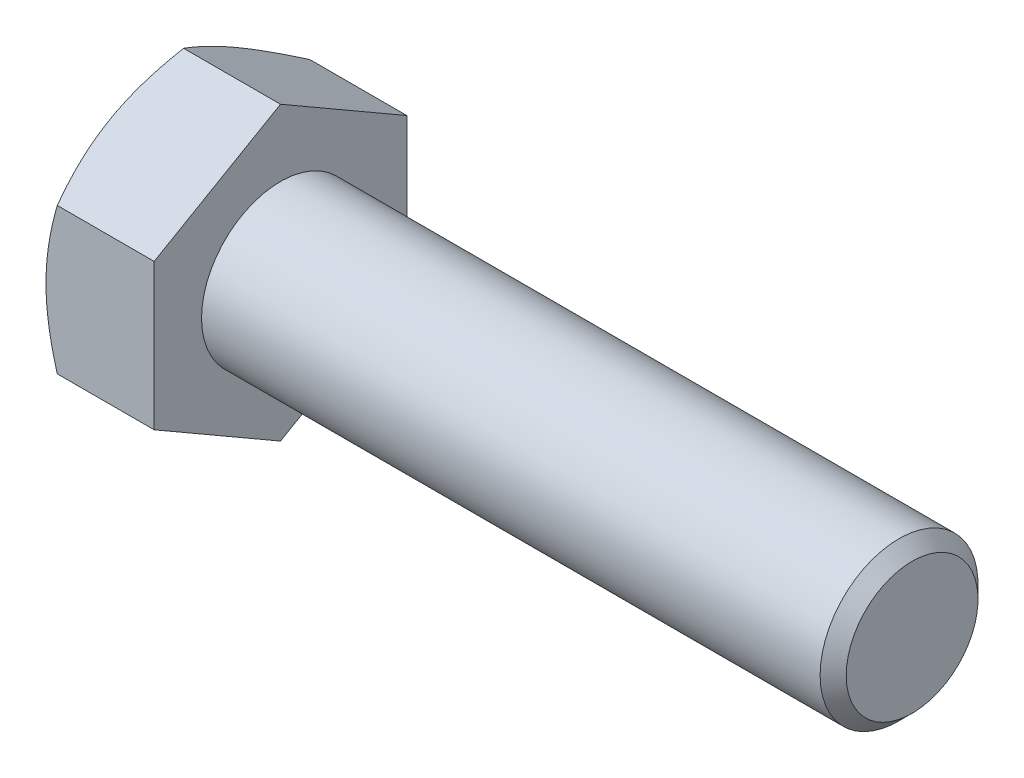
ISO-10303-21;
HEADER;
FILE_DESCRIPTION(('STEP AP214'),'2;1');
FILE_NAME('part.step','',(''),(''),'','','');
FILE_SCHEMA(('AUTOMOTIVE_DESIGN { 1 0 10303 214 1 1 1 1 }'));
ENDSEC;
DATA;
#1=APPLICATION_CONTEXT('core data for automotive mechanical design processes');
#2=APPLICATION_PROTOCOL_DEFINITION('international standard','automotive_design',2000,#1);
#3=PRODUCT_CONTEXT('',#1,'mechanical');
#4=PRODUCT('Part','Part','',(#3));
#5=PRODUCT_RELATED_PRODUCT_CATEGORY('part','',(#4));
#6=PRODUCT_DEFINITION_FORMATION('','',#4);
#7=PRODUCT_DEFINITION_CONTEXT('part definition',#1,'design');
#8=PRODUCT_DEFINITION('design','',#6,#7);
#9=PRODUCT_DEFINITION_SHAPE('','',#8);
#10=(LENGTH_UNIT() NAMED_UNIT(*) SI_UNIT(.MILLI.,.METRE.));
#11=(NAMED_UNIT(*) PLANE_ANGLE_UNIT() SI_UNIT($,.RADIAN.));
#12=(NAMED_UNIT(*) SI_UNIT($,.STERADIAN.) SOLID_ANGLE_UNIT());
#13=UNCERTAINTY_MEASURE_WITH_UNIT(LENGTH_MEASURE(1.E-05),#10,'distance_accuracy_value','');
#14=(GEOMETRIC_REPRESENTATION_CONTEXT(3) GLOBAL_UNCERTAINTY_ASSIGNED_CONTEXT((#13)) GLOBAL_UNIT_ASSIGNED_CONTEXT((#10,
#11,#12)) REPRESENTATION_CONTEXT('',''));
#15=CARTESIAN_POINT('',(0.,0.,0.));
#16=DIRECTION('',(0.,0.,1.));
#17=DIRECTION('',(1.,0.,0.));
#18=AXIS2_PLACEMENT_3D('',#15,#16,#17);
#19=CARTESIAN_POINT('',(0.,9.23760430703402,0.));
#20=DIRECTION('',(1.,0.,0.));
#21=DIRECTION('',(0.,0.,-1.));
#22=AXIS2_PLACEMENT_3D('',#19,#20,#21);
#23=PLANE('',#22);
#24=CARTESIAN_POINT('',(0.,0.,0.));
#25=DIRECTION('',(1.,0.,0.));
#26=DIRECTION('',(0.,0.,-1.));
#27=AXIS2_PLACEMENT_3D('',#24,#25,#26);
#28=CIRCLE('',#27,8.);
#29=CARTESIAN_POINT('',(0.,-6.92820323027551,-4.));
#30=VERTEX_POINT('',#29);
#31=CARTESIAN_POINT('',(0.,0.,-8.));
#32=VERTEX_POINT('',#31);
#33=EDGE_CURVE('E328',#30,#32,#28,.T.);
#34=ORIENTED_EDGE('',*,*,#33,.F.);
#35=CARTESIAN_POINT('',(0.,0.,0.));
#36=DIRECTION('',(1.,0.,0.));
#37=DIRECTION('',(0.,0.,-1.));
#38=AXIS2_PLACEMENT_3D('',#35,#36,#37);
#39=CIRCLE('',#38,8.);
#40=CARTESIAN_POINT('',(0.,-6.9282032302755,4.00000000000001));
#41=VERTEX_POINT('',#40);
#42=EDGE_CURVE('E327',#41,#30,#39,.T.);
#43=ORIENTED_EDGE('',*,*,#42,.F.);
#44=CARTESIAN_POINT('',(0.,0.,0.));
#45=DIRECTION('',(1.,0.,0.));
#46=DIRECTION('',(0.,0.,-1.));
#47=AXIS2_PLACEMENT_3D('',#44,#45,#46);
#48=CIRCLE('',#47,8.);
#49=CARTESIAN_POINT('',(0.,0.,8.));
#50=VERTEX_POINT('',#49);
#51=EDGE_CURVE('E89',#50,#41,#48,.T.);
#52=ORIENTED_EDGE('',*,*,#51,.F.);
#53=CARTESIAN_POINT('',(0.,0.,0.));
#54=DIRECTION('',(1.,0.,0.));
#55=DIRECTION('',(0.,0.,-1.));
#56=AXIS2_PLACEMENT_3D('',#53,#54,#55);
#57=CIRCLE('',#56,8.);
#58=CARTESIAN_POINT('',(0.,6.92820323027551,4.00000000000001));
#59=VERTEX_POINT('',#58);
#60=EDGE_CURVE('E87',#59,#50,#57,.T.);
#61=ORIENTED_EDGE('',*,*,#60,.F.);
#62=CARTESIAN_POINT('',(0.,0.,0.));
#63=DIRECTION('',(1.,0.,0.));
#64=DIRECTION('',(0.,1.,0.));
#65=AXIS2_PLACEMENT_3D('',#62,#63,#64);
#66=CIRCLE('',#65,8.);
#67=CARTESIAN_POINT('',(0.,6.9282032302755,-4.00000000000001));
#68=VERTEX_POINT('',#67);
#69=EDGE_CURVE('E20',#68,#59,#66,.T.);
#70=ORIENTED_EDGE('',*,*,#69,.F.);
#71=CARTESIAN_POINT('',(0.,0.,0.));
#72=DIRECTION('',(1.,0.,0.));
#73=DIRECTION('',(0.,0.,-1.));
#74=AXIS2_PLACEMENT_3D('',#71,#72,#73);
#75=CIRCLE('',#74,8.);
#76=EDGE_CURVE('E255',#32,#68,#75,.T.);
#77=ORIENTED_EDGE('',*,*,#76,.F.);
#78=EDGE_LOOP('',(#34,#43,#52,#61,#70,#77));
#79=FACE_BOUND('',#78,.T.);
#80=ADVANCED_FACE('F17',(#79),#23,.F.);
#81=CARTESIAN_POINT('',(0.718818366895225,0.,0.));
#82=DIRECTION('',(1.,0.,0.));
#83=DIRECTION('',(0.,1.,0.));
#84=AXIS2_PLACEMENT_3D('',#81,#82,#83);
#85=CONICAL_SURFACE('',#84,9.24502993287622,1.0471975511966);
#86=CARTESIAN_POINT('',(0.714531179816327,9.23760430703402,0.));
#87=CARTESIAN_POINT('',(0.605971186568708,9.04962004336392,-0.325598295700037));
#88=CARTESIAN_POINT('',(0.506511279503225,8.86013033415724,-0.653804099557457));
#89=CARTESIAN_POINT('',(0.331115524151834,8.47948058269123,-1.31310880898505));
#90=CARTESIAN_POINT('',(0.25506335451137,8.2883338178385,-1.64418471741241));
#91=CARTESIAN_POINT('',(0.161684202183004,7.99980970900142,-2.14392313312675));
#92=CARTESIAN_POINT('',(0.133996332855683,7.90327053836403,-2.31113388159127));
#93=CARTESIAN_POINT('',(0.0860680538837103,7.70973002472827,-2.64635588453139));
#94=CARTESIAN_POINT('',(0.0658274482214168,7.61272869396238,-2.81436711781971));
#95=CARTESIAN_POINT('',(0.0331493236756256,7.41790506415178,-3.15181154316665));
#96=CARTESIAN_POINT('',(0.020751486812314,7.32008108832731,-3.32124763949303));
#97=CARTESIAN_POINT('',(0.00415966475011427,7.12424074860085,-3.6604530580708));
#98=CARTESIAN_POINT('',(-3.26957018920315E-05,7.02622435044303,-3.83022243965505));
#99=CARTESIAN_POINT('',(0.,6.92820323027551,-4.00000000000001));
#100=B_SPLINE_CURVE_WITH_KNOTS('',3,(#86,#87,#88,#89,#90,#91,#92,#93,#94,#95,#96,#97,#98,#99),
.UNSPECIFIED.,.F.,.F.,(4,2,2,2,2,2,4),(0.,1.17445865342508,2.34298309186419,2.92801198525018,
3.51302547912926,4.10097577386236,4.68904247546297),.UNSPECIFIED.);
#101=CARTESIAN_POINT('',(0.714531179816327,9.23760430703402,0.));
#102=VERTEX_POINT('',#101);
#103=EDGE_CURVE('E99',#102,#68,#100,.T.);
#104=ORIENTED_EDGE('',*,*,#103,.T.);
#105=ORIENTED_EDGE('',*,*,#69,.T.);
#106=CARTESIAN_POINT('',(0.,6.92820323027551,4.00000000000001));
#107=CARTESIAN_POINT('',(-3.26957018919394E-05,7.02622435044303,3.83022243965505));
#108=CARTESIAN_POINT('',(0.00415966475011398,7.12424074860085,3.6604530580708));
#109=CARTESIAN_POINT('',(0.0207514868123135,7.32008108832731,3.32124763949303));
#110=CARTESIAN_POINT('',(0.0331493236756252,7.41790506415178,3.15181154316665));
#111=CARTESIAN_POINT('',(0.0658274482214167,7.61272869396238,2.81436711781971));
#112=CARTESIAN_POINT('',(0.0860680538837103,7.70973002472827,2.64635588453139));
#113=CARTESIAN_POINT('',(0.133996332855684,7.90327053836403,2.31113388159127));
#114=CARTESIAN_POINT('',(0.161684202183004,7.99980970900142,2.14392313312675));
#115=CARTESIAN_POINT('',(0.255063354511371,8.2883338178385,1.64418471741241));
#116=CARTESIAN_POINT('',(0.331115524151834,8.47948058269123,1.31310880898505));
#117=CARTESIAN_POINT('',(0.506511279503226,8.86013033415724,0.653804099557456));
#118=CARTESIAN_POINT('',(0.605971186568708,9.04962004336392,0.325598295700036));
#119=CARTESIAN_POINT('',(0.714531179816327,9.23760430703402,0.));
#120=B_SPLINE_CURVE_WITH_KNOTS('',3,(#106,#107,#108,#109,#110,#111,#112,#113,#114,#115,#116,
#117,#118,#119),.UNSPECIFIED.,.F.,.F.,(4,2,2,2,2,2,4),(0.,0.588066701600602,1.17601699633371,
1.76103049021279,2.34605938359878,3.51458382203788,4.68904247546297),.UNSPECIFIED.);
#121=EDGE_CURVE('E97',#59,#102,#120,.T.);
#122=ORIENTED_EDGE('',*,*,#121,.T.);
#123=EDGE_LOOP('',(#104,#105,#122));
#124=FACE_BOUND('',#123,.T.);
#125=ADVANCED_FACE('F95',(#124),#85,.T.);
#126=CARTESIAN_POINT('',(0.718818366895219,0.,0.));
#127=DIRECTION('',(1.,0.,0.));
#128=DIRECTION('',(0.,0.,-1.));
#129=AXIS2_PLACEMENT_3D('',#126,#127,#128);
#130=CONICAL_SURFACE('',#129,9.24502993287621,1.0471975511966);
#131=CARTESIAN_POINT('',(0.714531179816321,4.618802153517,8.));
#132=CARTESIAN_POINT('',(0.605971186568703,4.8067864171871,7.67440170429996));
#133=CARTESIAN_POINT('',(0.506511279503222,4.99627612639378,7.34619590044255));
#134=CARTESIAN_POINT('',(0.331115524151831,5.37692587785979,6.68689119101496));
#135=CARTESIAN_POINT('',(0.255063354511368,5.56807264271252,6.3558152825876));
#136=CARTESIAN_POINT('',(0.161684202183002,5.85659675154959,5.85607686687326));
#137=CARTESIAN_POINT('',(0.133996332855682,5.95313592218698,5.68886611840874));
#138=CARTESIAN_POINT('',(0.0860680538837097,6.14667643582275,5.35364411546862));
#139=CARTESIAN_POINT('',(0.0658274482214168,6.24367776658864,5.18563288218031));
#140=CARTESIAN_POINT('',(0.0331493236756258,6.43850139639923,4.84818845683336));
#141=CARTESIAN_POINT('',(0.0207514868123138,6.53632537222371,4.67875236050699));
#142=CARTESIAN_POINT('',(0.00415966475011389,6.73216571195016,4.33954694192922));
#143=CARTESIAN_POINT('',(-3.26957018923342E-05,6.83018211010798,4.16977756034497));
#144=CARTESIAN_POINT('',(0.,6.92820323027551,4.00000000000001));
#145=B_SPLINE_CURVE_WITH_KNOTS('',3,(#131,#132,#133,#134,#135,#136,#137,#138,#139,#140,#141,
#142,#143,#144),.UNSPECIFIED.,.F.,.F.,(4,2,2,2,2,2,4),(0.,1.17445865342508,2.34298309186418,
2.92801198525016,3.51302547912924,4.10097577386235,4.68904247546295),.UNSPECIFIED.);
#146=CARTESIAN_POINT('',(0.714531179816321,4.618802153517,8.));
#147=VERTEX_POINT('',#146);
#148=EDGE_CURVE('E102',#147,#59,#145,.T.);
#149=ORIENTED_EDGE('',*,*,#148,.T.);
#150=ORIENTED_EDGE('',*,*,#60,.T.);
#151=CARTESIAN_POINT('',(0.,0.,8.));
#152=CARTESIAN_POINT('',(-3.26957018925853E-05,0.196042240335043,8.));
#153=CARTESIAN_POINT('',(0.00415966475011326,0.392075036650689,8.));
#154=CARTESIAN_POINT('',(0.0207514868123118,0.783755716103597,8.));
#155=CARTESIAN_POINT('',(0.0331493236756227,0.979403667752545,8.));
#156=CARTESIAN_POINT('',(0.0658274482214139,1.36905092737374,8.));
#157=CARTESIAN_POINT('',(0.0860680538837081,1.56305358890551,8.));
#158=CARTESIAN_POINT('',(0.133996332855681,1.95013461617705,8.));
#159=CARTESIAN_POINT('',(0.161684202183001,2.14321295745183,8.));
#160=CARTESIAN_POINT('',(0.255063354511366,2.72026117512596,8.));
#161=CARTESIAN_POINT('',(0.331115524151829,3.10255470483144,8.));
#162=CARTESIAN_POINT('',(0.506511279503221,3.86385420776345,8.));
#163=CARTESIAN_POINT('',(0.605971186568704,4.24283362617681,8.));
#164=CARTESIAN_POINT('',(0.714531179816321,4.618802153517,8.));
#165=B_SPLINE_CURVE_WITH_KNOTS('',3,(#151,#152,#153,#154,#155,#156,#157,#158,#159,#160,#161,
#162,#163,#164),.UNSPECIFIED.,.F.,.F.,(4,2,2,2,2,2,4),(0.,0.5880667016006,1.17601699633371,
1.76103049021279,2.34605938359877,3.51458382203787,4.68904247546295),.UNSPECIFIED.);
#166=EDGE_CURVE('E105',#50,#147,#165,.T.);
#167=ORIENTED_EDGE('',*,*,#166,.T.);
#168=EDGE_LOOP('',(#149,#150,#167));
#169=FACE_BOUND('',#168,.T.);
#170=ADVANCED_FACE('F103',(#169),#130,.T.);
#171=CARTESIAN_POINT('',(0.718818366895217,0.,0.));
#172=DIRECTION('',(1.,0.,0.));
#173=DIRECTION('',(0.,0.,-1.));
#174=AXIS2_PLACEMENT_3D('',#171,#172,#173);
#175=CONICAL_SURFACE('',#174,9.24502993287621,1.0471975511966);
#176=ORIENTED_EDGE('',*,*,#51,.T.);
#177=CARTESIAN_POINT('',(0.,-6.9282032302755,4.00000000000001));
#178=CARTESIAN_POINT('',(-3.26957018939549E-05,-6.83018211010798,4.16977756034497));
#179=CARTESIAN_POINT('',(0.00415966475011213,-6.73216571195016,4.33954694192922));
#180=CARTESIAN_POINT('',(0.0207514868123117,-6.5363253722237,4.67875236050699));
#181=CARTESIAN_POINT('',(0.0331493236756234,-6.43850139639923,4.84818845683337));
#182=CARTESIAN_POINT('',(0.0658274482214147,-6.24367776658863,5.18563288218031));
#183=CARTESIAN_POINT('',(0.0860680538837083,-6.14667643582275,5.35364411546862));
#184=CARTESIAN_POINT('',(0.133996332855681,-5.95313592218698,5.68886611840874));
#185=CARTESIAN_POINT('',(0.161684202183,-5.85659675154959,5.85607686687326));
#186=CARTESIAN_POINT('',(0.255063354511366,-5.56807264271252,6.3558152825876));
#187=CARTESIAN_POINT('',(0.331115524151829,-5.37692587785978,6.68689119101496));
#188=CARTESIAN_POINT('',(0.50651127950322,-4.99627612639377,7.34619590044255));
#189=CARTESIAN_POINT('',(0.605971186568702,-4.8067864171871,7.67440170429997));
#190=CARTESIAN_POINT('',(0.71453117981632,-4.618802153517,8.));
#191=B_SPLINE_CURVE_WITH_KNOTS('',3,(#177,#178,#179,#180,#181,#182,#183,#184,#185,#186,#187,
#188,#189,#190),.UNSPECIFIED.,.F.,.F.,(4,2,2,2,2,2,4),(0.,0.588066701600601,1.17601699633371,
1.76103049021279,2.34605938359877,3.51458382203787,4.68904247546295),.UNSPECIFIED.);
#192=CARTESIAN_POINT('',(0.71453117981632,-4.618802153517,8.));
#193=VERTEX_POINT('',#192);
#194=EDGE_CURVE('E174',#41,#193,#191,.T.);
#195=ORIENTED_EDGE('',*,*,#194,.T.);
#196=CARTESIAN_POINT('',(0.714531179816318,-4.618802153517,8.));
#197=CARTESIAN_POINT('',(0.605971186568701,-4.2428336261768,8.));
#198=CARTESIAN_POINT('',(0.506511279503219,-3.86385420776344,8.));
#199=CARTESIAN_POINT('',(0.331115524151827,-3.10255470483143,8.));
#200=CARTESIAN_POINT('',(0.255063354511365,-2.72026117512596,8.));
#201=CARTESIAN_POINT('',(0.161684202182999,-2.14321295745182,8.));
#202=CARTESIAN_POINT('',(0.13399633285568,-1.95013461617704,8.));
#203=CARTESIAN_POINT('',(0.0860680538837073,-1.56305358890551,8.));
#204=CARTESIAN_POINT('',(0.0658274482214137,-1.36905092737373,8.));
#205=CARTESIAN_POINT('',(0.0331493236756224,-0.979403667752542,8.));
#206=CARTESIAN_POINT('',(0.0207514868123108,-0.783755716103594,8.));
#207=CARTESIAN_POINT('',(0.0041596647501115,-0.392075036650687,8.));
#208=CARTESIAN_POINT('',(-3.26957018943574E-05,-0.196042240335042,8.));
#209=CARTESIAN_POINT('',(0.,0.,8.));
#210=B_SPLINE_CURVE_WITH_KNOTS('',3,(#196,#197,#198,#199,#200,#201,#202,#203,#204,#205,#206,
#207,#208,#209),.UNSPECIFIED.,.F.,.F.,(4,2,2,2,2,2,4),(0.,1.17445865342508,2.34298309186418,
2.92801198525016,3.51302547912924,4.10097577386235,4.68904247546295),.UNSPECIFIED.);
#211=EDGE_CURVE('E148',#193,#50,#210,.T.);
#212=ORIENTED_EDGE('',*,*,#211,.T.);
#213=EDGE_LOOP('',(#176,#195,#212));
#214=FACE_BOUND('',#213,.T.);
#215=ADVANCED_FACE('F139',(#214),#175,.T.);
#216=CARTESIAN_POINT('',(0.718818366895225,0.,0.));
#217=DIRECTION('',(1.,0.,0.));
#218=DIRECTION('',(0.,0.,-1.));
#219=AXIS2_PLACEMENT_3D('',#216,#217,#218);
#220=CONICAL_SURFACE('',#219,9.24502993287622,1.0471975511966);
#221=ORIENTED_EDGE('',*,*,#42,.T.);
#222=CARTESIAN_POINT('',(0.,-6.92820323027552,-4.));
#223=CARTESIAN_POINT('',(-3.26957018884653E-05,-7.02622435044304,-3.83022243965504));
#224=CARTESIAN_POINT('',(0.00415966475011762,-7.12424074860086,-3.66045305807079));
#225=CARTESIAN_POINT('',(0.0207514868123167,-7.32008108832731,-3.32124763949302));
#226=CARTESIAN_POINT('',(0.0331493236756279,-7.41790506415179,-3.15181154316664));
#227=CARTESIAN_POINT('',(0.0658274482214187,-7.61272869396238,-2.8143671178197));
#228=CARTESIAN_POINT('',(0.0860680538837122,-7.70973002472827,-2.64635588453139));
#229=CARTESIAN_POINT('',(0.133996332855685,-7.90327053836404,-2.31113388159126));
#230=CARTESIAN_POINT('',(0.161684202183005,-7.99980970900143,-2.14392313312674));
#231=CARTESIAN_POINT('',(0.255063354511372,-8.2883338178385,-1.6441847174124));
#232=CARTESIAN_POINT('',(0.331115524151835,-8.47948058269123,-1.31310880898505));
#233=CARTESIAN_POINT('',(0.506511279503227,-8.86013033415724,-0.653804099557456));
#234=CARTESIAN_POINT('',(0.605971186568709,-9.04962004336392,-0.325598295700037));
#235=CARTESIAN_POINT('',(0.714531179816327,-9.23760430703402,0.));
#236=B_SPLINE_CURVE_WITH_KNOTS('',3,(#222,#223,#224,#225,#226,#227,#228,#229,#230,#231,#232,
#233,#234,#235),.UNSPECIFIED.,.F.,.F.,(4,2,2,2,2,2,4),(0.,0.5880667016006,1.17601699633371,
1.76103049021279,2.34605938359877,3.51458382203787,4.68904247546296),.UNSPECIFIED.);
#237=CARTESIAN_POINT('',(0.714531179816327,-9.23760430703402,0.));
#238=VERTEX_POINT('',#237);
#239=EDGE_CURVE('E302',#30,#238,#236,.T.);
#240=ORIENTED_EDGE('',*,*,#239,.T.);
#241=CARTESIAN_POINT('',(0.714531179816327,-9.23760430703402,0.));
#242=CARTESIAN_POINT('',(0.605971186568709,-9.04962004336392,0.325598295700037));
#243=CARTESIAN_POINT('',(0.506511279503226,-8.86013033415724,0.653804099557457));
#244=CARTESIAN_POINT('',(0.331115524151832,-8.47948058269123,1.31310880898505));
#245=CARTESIAN_POINT('',(0.255063354511368,-8.28833381783849,1.64418471741241));
#246=CARTESIAN_POINT('',(0.161684202183001,-7.99980970900142,2.14392313312675));
#247=CARTESIAN_POINT('',(0.133996332855682,-7.90327053836403,2.31113388159127));
#248=CARTESIAN_POINT('',(0.086068053883709,-7.70973002472826,2.64635588453139));
#249=CARTESIAN_POINT('',(0.0658274482214155,-7.61272869396237,2.81436711781971));
#250=CARTESIAN_POINT('',(0.033149323675624,-7.41790506415178,3.15181154316665));
#251=CARTESIAN_POINT('',(0.0207514868123121,-7.3200810883273,3.32124763949303));
#252=CARTESIAN_POINT('',(0.00415966475011229,-7.12424074860085,3.6604530580708));
#253=CARTESIAN_POINT('',(-3.26957018938749E-05,-7.02622435044302,3.83022243965505));
#254=CARTESIAN_POINT('',(0.,-6.9282032302755,4.00000000000001));
#255=B_SPLINE_CURVE_WITH_KNOTS('',3,(#241,#242,#243,#244,#245,#246,#247,#248,#249,#250,#251,
#252,#253,#254),.UNSPECIFIED.,.F.,.F.,(4,2,2,2,2,2,4),(0.,1.17445865342509,2.34298309186419,
2.92801198525018,3.51302547912926,4.10097577386237,4.68904247546297),.UNSPECIFIED.);
#256=EDGE_CURVE('E169',#238,#41,#255,.T.);
#257=ORIENTED_EDGE('',*,*,#256,.T.);
#258=EDGE_LOOP('',(#221,#240,#257));
#259=FACE_BOUND('',#258,.T.);
#260=ADVANCED_FACE('F318',(#259),#220,.T.);
#261=CARTESIAN_POINT('',(0.718818366895236,0.,0.));
#262=DIRECTION('',(1.,0.,0.));
#263=DIRECTION('',(0.,0.,-1.));
#264=AXIS2_PLACEMENT_3D('',#261,#262,#263);
#265=CONICAL_SURFACE('',#264,9.24502993287624,1.0471975511966);
#266=ORIENTED_EDGE('',*,*,#33,.T.);
#267=CARTESIAN_POINT('',(0.,0.,-8.));
#268=CARTESIAN_POINT('',(-3.26957018927223E-05,-0.196042240335048,-8.));
#269=CARTESIAN_POINT('',(0.0041596647501136,-0.392075036650699,-8.));
#270=CARTESIAN_POINT('',(0.020751486812314,-0.783755716103618,-8.));
#271=CARTESIAN_POINT('',(0.0331493236756263,-0.979403667752572,-8.));
#272=CARTESIAN_POINT('',(0.0658274482214192,-1.36905092737377,-8.));
#273=CARTESIAN_POINT('',(0.0860680538837136,-1.56305358890556,-8.));
#274=CARTESIAN_POINT('',(0.133996332855689,-1.9501346161771,-8.));
#275=CARTESIAN_POINT('',(0.16168420218301,-2.14321295745189,-8.));
#276=CARTESIAN_POINT('',(0.255063354511381,-2.72026117512604,-8.));
#277=CARTESIAN_POINT('',(0.331115524151849,-3.10255470483152,-8.));
#278=CARTESIAN_POINT('',(0.50651127950325,-3.86385420776356,-8.));
#279=CARTESIAN_POINT('',(0.605971186568736,-4.24283362617692,-8.));
#280=CARTESIAN_POINT('',(0.714531179816359,-4.61880215351713,-8.));
#281=B_SPLINE_CURVE_WITH_KNOTS('',3,(#267,#268,#269,#270,#271,#272,#273,#274,#275,#276,#277,
#278,#279,#280),.UNSPECIFIED.,.F.,.F.,(4,2,2,2,2,2,4),(0.,0.588066701600616,1.17601699633374,
1.76103049021284,2.34605938359884,3.51458382203797,4.68904247546308),.UNSPECIFIED.);
#282=CARTESIAN_POINT('',(0.71453117981632,-4.61880215351711,-7.99999999999993));
#283=VERTEX_POINT('',#282);
#284=EDGE_CURVE('E233',#32,#283,#281,.T.);
#285=ORIENTED_EDGE('',*,*,#284,.T.);
#286=CARTESIAN_POINT('',(0.71453117981628,-4.61880215351709,-7.99999999999986));
#287=CARTESIAN_POINT('',(0.605971186568667,-4.80678641718719,-7.67440170429984));
#288=CARTESIAN_POINT('',(0.506511279503192,-4.99627612639386,-7.34619590044243));
#289=CARTESIAN_POINT('',(0.331115524151811,-5.37692587785985,-6.68689119101486));
#290=CARTESIAN_POINT('',(0.255063354511353,-5.56807264271258,-6.35581528258751));
#291=CARTESIAN_POINT('',(0.161684202182993,-5.85659675154964,-5.85607686687319));
#292=CARTESIAN_POINT('',(0.133996332855675,-5.95313592218703,-5.68886611840868));
#293=CARTESIAN_POINT('',(0.0860680538837059,-6.14667643582279,-5.35364411546856));
#294=CARTESIAN_POINT('',(0.0658274482214138,-6.24367776658867,-5.18563288218026));
#295=CARTESIAN_POINT('',(0.033149323675625,-6.43850139639926,-4.84818845683333));
#296=CARTESIAN_POINT('',(0.0207514868123147,-6.53632537222373,-4.67875236050695));
#297=CARTESIAN_POINT('',(0.00415966475011692,-6.73216571195018,-4.3395469419292));
#298=CARTESIAN_POINT('',(-3.26957018886966E-05,-6.830182110108,-4.16977756034496));
#299=CARTESIAN_POINT('',(0.,-6.92820323027552,-4.));
#300=B_SPLINE_CURVE_WITH_KNOTS('',3,(#286,#287,#288,#289,#290,#291,#292,#293,#294,#295,#296,
#297,#298,#299),.UNSPECIFIED.,.F.,.F.,(4,2,2,2,2,2,4),(0.,1.17445865342504,2.3429830918641,
2.92801198525007,3.51302547912913,4.10097577386221,4.68904247546279),.UNSPECIFIED.);
#301=EDGE_CURVE('E301',#283,#30,#300,.T.);
#302=ORIENTED_EDGE('',*,*,#301,.T.);
#303=EDGE_LOOP('',(#266,#285,#302));
#304=FACE_BOUND('',#303,.T.);
#305=ADVANCED_FACE('F247',(#304),#265,.T.);
#306=CARTESIAN_POINT('',(0.718818366895219,0.,0.));
#307=DIRECTION('',(1.,0.,0.));
#308=DIRECTION('',(0.,0.,-1.));
#309=AXIS2_PLACEMENT_3D('',#306,#307,#308);
#310=CONICAL_SURFACE('',#309,9.24502993287621,1.0471975511966);
#311=CARTESIAN_POINT('',(0.714531179816322,4.618802153517,-8.));
#312=CARTESIAN_POINT('',(0.605971186568704,4.2428336261768,-8.));
#313=CARTESIAN_POINT('',(0.506511279503222,3.86385420776345,-8.));
#314=CARTESIAN_POINT('',(0.331115524151831,3.10255470483143,-8.));
#315=CARTESIAN_POINT('',(0.255063354511368,2.72026117512596,-8.));
#316=CARTESIAN_POINT('',(0.161684202183001,2.14321295745183,-8.));
#317=CARTESIAN_POINT('',(0.133996332855681,1.95013461617705,-8.));
#318=CARTESIAN_POINT('',(0.0860680538837084,1.56305358890551,-8.));
#319=CARTESIAN_POINT('',(0.065827448221415,1.36905092737374,-8.));
#320=CARTESIAN_POINT('',(0.0331493236756243,0.979403667752545,-8.));
#321=CARTESIAN_POINT('',(0.0207514868123132,0.783755716103597,-8.));
#322=CARTESIAN_POINT('',(0.00415966475011438,0.392075036650689,-8.));
#323=CARTESIAN_POINT('',(-3.2695701891586E-05,0.196042240335044,-8.));
#324=CARTESIAN_POINT('',(0.,0.,-8.));
#325=B_SPLINE_CURVE_WITH_KNOTS('',3,(#311,#312,#313,#314,#315,#316,#317,#318,#319,#320,#321,
#322,#323,#324),.UNSPECIFIED.,.F.,.F.,(4,2,2,2,2,2,4),(0.,1.17445865342508,2.34298309186418,
2.92801198525016,3.51302547912924,4.10097577386235,4.68904247546295),.UNSPECIFIED.);
#326=CARTESIAN_POINT('',(0.714531179816321,4.618802153517,-8.));
#327=VERTEX_POINT('',#326);
#328=EDGE_CURVE('E225',#327,#32,#325,.T.);
#329=ORIENTED_EDGE('',*,*,#328,.T.);
#330=ORIENTED_EDGE('',*,*,#76,.T.);
#331=CARTESIAN_POINT('',(0.,6.92820323027551,-4.00000000000001));
#332=CARTESIAN_POINT('',(-3.2695701891247E-05,6.83018211010798,-4.16977756034497));
#333=CARTESIAN_POINT('',(0.00415966475011474,6.73216571195016,-4.33954694192922));
#334=CARTESIAN_POINT('',(0.0207514868123137,6.53632537222371,-4.67875236050699));
#335=CARTESIAN_POINT('',(0.0331493236756248,6.43850139639923,-4.84818845683336));
#336=CARTESIAN_POINT('',(0.0658274482214156,6.24367776658864,-5.18563288218031));
#337=CARTESIAN_POINT('',(0.0860680538837091,6.14667643582275,-5.35364411546862));
#338=CARTESIAN_POINT('',(0.133996332855682,5.95313592218698,-5.68886611840874));
#339=CARTESIAN_POINT('',(0.161684202183001,5.85659675154959,-5.85607686687326));
#340=CARTESIAN_POINT('',(0.255063354511367,5.56807264271252,-6.3558152825876));
#341=CARTESIAN_POINT('',(0.33111552415183,5.37692587785979,-6.68689119101496));
#342=CARTESIAN_POINT('',(0.506511279503222,4.99627612639378,-7.34619590044255));
#343=CARTESIAN_POINT('',(0.605971186568704,4.8067864171871,-7.67440170429997));
#344=CARTESIAN_POINT('',(0.714531179816321,4.618802153517,-8.));
#345=B_SPLINE_CURVE_WITH_KNOTS('',3,(#331,#332,#333,#334,#335,#336,#337,#338,#339,#340,#341,
#342,#343,#344),.UNSPECIFIED.,.F.,.F.,(4,2,2,2,2,2,4),(0.,0.588066701600599,1.1760169963337,
1.76103049021279,2.34605938359877,3.51458382203787,4.68904247546295),.UNSPECIFIED.);
#346=EDGE_CURVE('E115',#68,#327,#345,.T.);
#347=ORIENTED_EDGE('',*,*,#346,.T.);
#348=EDGE_LOOP('',(#329,#330,#347));
#349=FACE_BOUND('',#348,.T.);
#350=ADVANCED_FACE('F242',(#349),#310,.T.);
#351=CARTESIAN_POINT('',(46.85,0.,0.));
#352=DIRECTION('',(-1.,0.,0.));
#353=DIRECTION('',(0.,0.,1.));
#354=AXIS2_PLACEMENT_3D('',#351,#352,#353);
#355=PLANE('',#354);
#356=CARTESIAN_POINT('',(46.8500000000063,0.,0.));
#357=DIRECTION('',(-1.,0.,0.));
#358=DIRECTION('',(0.,0.,1.));
#359=AXIS2_PLACEMENT_3D('',#356,#357,#358);
#360=CIRCLE('',#359,4.17200000003959);
#361=CARTESIAN_POINT('',(46.8500000000063,0.,4.17200000003959));
#362=VERTEX_POINT('',#361);
#363=EDGE_CURVE('E196',#362,#362,#360,.T.);
#364=ORIENTED_EDGE('',*,*,#363,.F.);
#365=EDGE_LOOP('',(#364));
#366=FACE_BOUND('',#365,.T.);
#367=ADVANCED_FACE('F246',(#366),#355,.F.);
#368=CARTESIAN_POINT('',(6.85,4.618802153517,-8.));
#369=DIRECTION('',(0.,-0.866025403784438,0.500000000000001));
#370=DIRECTION('',(0.,-0.500000000000001,-0.866025403784438));
#371=AXIS2_PLACEMENT_3D('',#368,#369,#370);
#372=PLANE('',#371);
#373=DIRECTION('',(1.,0.,0.));
#374=VECTOR('',#373,1.);
#375=CARTESIAN_POINT('',(6.85,9.23760430703402,0.));
#376=LINE('',#375,#374);
#377=CARTESIAN_POINT('',(6.85,9.23760430703402,0.));
#378=VERTEX_POINT('',#377);
#379=EDGE_CURVE('E108',#102,#378,#376,.T.);
#380=ORIENTED_EDGE('',*,*,#379,.T.);
#381=DIRECTION('',(0.,0.500000000000001,0.866025403784438));
#382=VECTOR('',#381,1.);
#383=CARTESIAN_POINT('',(6.85,4.618802153517,-8.));
#384=LINE('',#383,#382);
#385=CARTESIAN_POINT('',(6.85,4.618802153517,-8.));
#386=VERTEX_POINT('',#385);
#387=EDGE_CURVE('E192',#386,#378,#384,.T.);
#388=ORIENTED_EDGE('',*,*,#387,.F.);
#389=DIRECTION('',(1.,0.,0.));
#390=VECTOR('',#389,1.);
#391=CARTESIAN_POINT('',(6.85,4.618802153517,-8.));
#392=LINE('',#391,#390);
#393=EDGE_CURVE('E232',#386,#327,#392,.F.);
#394=ORIENTED_EDGE('',*,*,#393,.T.);
#395=ORIENTED_EDGE('',*,*,#346,.F.);
#396=ORIENTED_EDGE('',*,*,#103,.F.);
#397=EDGE_LOOP('',(#380,#388,#394,#395,#396));
#398=FACE_BOUND('',#397,.T.);
#399=ADVANCED_FACE('F257',(#398),#372,.F.);
#400=CARTESIAN_POINT('',(6.85,9.23760430703402,0.));
#401=DIRECTION('',(0.,-0.866025403784438,-0.500000000000001));
#402=DIRECTION('',(0.,0.500000000000001,-0.866025403784438));
#403=AXIS2_PLACEMENT_3D('',#400,#401,#402);
#404=PLANE('',#403);
#405=DIRECTION('',(-1.,0.,0.));
#406=VECTOR('',#405,1.);
#407=CARTESIAN_POINT('',(6.85,4.618802153517,8.));
#408=LINE('',#407,#406);
#409=CARTESIAN_POINT('',(6.85,4.618802153517,8.));
#410=VERTEX_POINT('',#409);
#411=EDGE_CURVE('E147',#147,#410,#408,.F.);
#412=ORIENTED_EDGE('',*,*,#411,.T.);
#413=DIRECTION('',(0.,-0.500000000000001,0.866025403784438));
#414=VECTOR('',#413,1.);
#415=CARTESIAN_POINT('',(6.85,9.23760430703402,0.));
#416=LINE('',#415,#414);
#417=EDGE_CURVE('E195',#378,#410,#416,.T.);
#418=ORIENTED_EDGE('',*,*,#417,.F.);
#419=ORIENTED_EDGE('',*,*,#379,.F.);
#420=ORIENTED_EDGE('',*,*,#121,.F.);
#421=ORIENTED_EDGE('',*,*,#148,.F.);
#422=EDGE_LOOP('',(#412,#418,#419,#420,#421));
#423=FACE_BOUND('',#422,.T.);
#424=ADVANCED_FACE('F111',(#423),#404,.F.);
#425=CARTESIAN_POINT('',(6.85,4.618802153517,8.));
#426=DIRECTION('',(0.,0.,-1.));
#427=DIRECTION('',(-1.,0.,0.));
#428=AXIS2_PLACEMENT_3D('',#425,#426,#427);
#429=PLANE('',#428);
#430=DIRECTION('',(1.,0.,0.));
#431=VECTOR('',#430,1.);
#432=CARTESIAN_POINT('',(6.85,-4.618802153517,8.));
#433=LINE('',#432,#431);
#434=CARTESIAN_POINT('',(6.85,-4.618802153517,8.));
#435=VERTEX_POINT('',#434);
#436=EDGE_CURVE('E178',#193,#435,#433,.T.);
#437=ORIENTED_EDGE('',*,*,#436,.T.);
#438=DIRECTION('',(0.,1.,0.));
#439=VECTOR('',#438,1.);
#440=CARTESIAN_POINT('',(6.85,9.23760430703402,8.));
#441=LINE('',#440,#439);
#442=EDGE_CURVE('E212',#410,#435,#441,.F.);
#443=ORIENTED_EDGE('',*,*,#442,.F.);
#444=ORIENTED_EDGE('',*,*,#411,.F.);
#445=ORIENTED_EDGE('',*,*,#166,.F.);
#446=ORIENTED_EDGE('',*,*,#211,.F.);
#447=EDGE_LOOP('',(#437,#443,#444,#445,#446));
#448=FACE_BOUND('',#447,.T.);
#449=ADVANCED_FACE('F153',(#448),#429,.F.);
#450=CARTESIAN_POINT('',(6.85,-9.23760430703402,0.));
#451=DIRECTION('',(0.,0.866025403784438,-0.500000000000001));
#452=DIRECTION('',(0.,0.500000000000001,0.866025403784438));
#453=AXIS2_PLACEMENT_3D('',#450,#451,#452);
#454=PLANE('',#453);
#455=DIRECTION('',(1.,0.,0.));
#456=VECTOR('',#455,1.);
#457=CARTESIAN_POINT('',(6.85,-9.23760430703402,0.));
#458=LINE('',#457,#456);
#459=CARTESIAN_POINT('',(6.85,-9.23760430703402,0.));
#460=VERTEX_POINT('',#459);
#461=EDGE_CURVE('E299',#238,#460,#458,.T.);
#462=ORIENTED_EDGE('',*,*,#461,.T.);
#463=DIRECTION('',(0.,-0.500000000000001,-0.866025403784438));
#464=VECTOR('',#463,1.);
#465=CARTESIAN_POINT('',(6.85,-4.618802153517,8.));
#466=LINE('',#465,#464);
#467=EDGE_CURVE('E207',#435,#460,#466,.T.);
#468=ORIENTED_EDGE('',*,*,#467,.F.);
#469=ORIENTED_EDGE('',*,*,#436,.F.);
#470=ORIENTED_EDGE('',*,*,#194,.F.);
#471=ORIENTED_EDGE('',*,*,#256,.F.);
#472=EDGE_LOOP('',(#462,#468,#469,#470,#471));
#473=FACE_BOUND('',#472,.T.);
#474=ADVANCED_FACE('F157',(#473),#454,.F.);
#475=CARTESIAN_POINT('',(6.85,-4.61880215351701,-8.));
#476=DIRECTION('',(0.,0.866025403784439,0.5));
#477=DIRECTION('',(0.,-0.5,0.866025403784439));
#478=AXIS2_PLACEMENT_3D('',#475,#476,#477);
#479=PLANE('',#478);
#480=DIRECTION('',(1.,0.,0.));
#481=VECTOR('',#480,1.);
#482=CARTESIAN_POINT('',(6.85,-4.61880215351726,-8.));
#483=LINE('',#482,#481);
#484=CARTESIAN_POINT('',(6.85,-4.61880215351717,-8.));
#485=VERTEX_POINT('',#484);
#486=EDGE_CURVE('E35',#283,#485,#483,.T.);
#487=ORIENTED_EDGE('',*,*,#486,.T.);
#488=DIRECTION('',(0.,0.5,-0.866025403784439));
#489=VECTOR('',#488,1.);
#490=CARTESIAN_POINT('',(6.85,-9.23760430703402,0.));
#491=LINE('',#490,#489);
#492=EDGE_CURVE('E202',#460,#485,#491,.T.);
#493=ORIENTED_EDGE('',*,*,#492,.F.);
#494=ORIENTED_EDGE('',*,*,#461,.F.);
#495=ORIENTED_EDGE('',*,*,#239,.F.);
#496=ORIENTED_EDGE('',*,*,#301,.F.);
#497=EDGE_LOOP('',(#487,#493,#494,#495,#496));
#498=FACE_BOUND('',#497,.T.);
#499=ADVANCED_FACE('F163',(#498),#479,.F.);
#500=CARTESIAN_POINT('',(6.85,4.618802153517,-8.));
#501=DIRECTION('',(0.,0.,1.));
#502=DIRECTION('',(0.,-1.,0.));
#503=AXIS2_PLACEMENT_3D('',#500,#501,#502);
#504=PLANE('',#503);
#505=ORIENTED_EDGE('',*,*,#393,.F.);
#506=DIRECTION('',(0.,1.,0.));
#507=VECTOR('',#506,1.);
#508=CARTESIAN_POINT('',(6.85,9.23760430703402,-8.));
#509=LINE('',#508,#507);
#510=EDGE_CURVE('E199',#485,#386,#509,.T.);
#511=ORIENTED_EDGE('',*,*,#510,.F.);
#512=ORIENTED_EDGE('',*,*,#486,.F.);
#513=ORIENTED_EDGE('',*,*,#284,.F.);
#514=ORIENTED_EDGE('',*,*,#328,.F.);
#515=EDGE_LOOP('',(#505,#511,#512,#513,#514));
#516=FACE_BOUND('',#515,.T.);
#517=ADVANCED_FACE('F239',(#516),#504,.F.);
#518=CARTESIAN_POINT('',(46.0220000001073,0.,0.));
#519=DIRECTION('',(-1.,0.,0.));
#520=DIRECTION('',(0.,0.,1.));
#521=AXIS2_PLACEMENT_3D('',#518,#519,#520);
#522=CONICAL_SURFACE('',#521,4.99999999988177,0.785398163363123);
#523=CARTESIAN_POINT('',(46.022,0.,0.));
#524=DIRECTION('',(-1.,0.,0.));
#525=DIRECTION('',(0.,0.,1.));
#526=AXIS2_PLACEMENT_3D('',#523,#524,#525);
#527=CIRCLE('',#526,5.);
#528=CARTESIAN_POINT('',(46.022,0.,5.));
#529=VERTEX_POINT('',#528);
#530=EDGE_CURVE('E26',#529,#529,#527,.T.);
#531=ORIENTED_EDGE('',*,*,#530,.F.);
#532=EDGE_LOOP('',(#531));
#533=FACE_BOUND('',#532,.T.);
#534=ORIENTED_EDGE('',*,*,#363,.T.);
#535=EDGE_LOOP('',(#534));
#536=FACE_BOUND('',#535,.T.);
#537=ADVANCED_FACE('F276',(#533,#536),#522,.T.);
#538=CARTESIAN_POINT('',(6.85,9.23760430703402,0.));
#539=DIRECTION('',(1.,0.,0.));
#540=DIRECTION('',(0.,0.,-1.));
#541=AXIS2_PLACEMENT_3D('',#538,#539,#540);
#542=PLANE('',#541);
#543=ORIENTED_EDGE('',*,*,#492,.T.);
#544=ORIENTED_EDGE('',*,*,#510,.T.);
#545=ORIENTED_EDGE('',*,*,#387,.T.);
#546=ORIENTED_EDGE('',*,*,#417,.T.);
#547=ORIENTED_EDGE('',*,*,#442,.T.);
#548=ORIENTED_EDGE('',*,*,#467,.T.);
#549=EDGE_LOOP('',(#543,#544,#545,#546,#547,#548));
#550=FACE_BOUND('',#549,.T.);
#551=CARTESIAN_POINT('',(6.85,0.,0.));
#552=DIRECTION('',(-1.,0.,0.));
#553=DIRECTION('',(0.,0.,1.));
#554=AXIS2_PLACEMENT_3D('',#551,#552,#553);
#555=CIRCLE('',#554,5.);
#556=CARTESIAN_POINT('',(6.85,0.,5.));
#557=VERTEX_POINT('',#556);
#558=EDGE_CURVE('E11',#557,#557,#555,.F.);
#559=ORIENTED_EDGE('',*,*,#558,.F.);
#560=EDGE_LOOP('',(#559));
#561=FACE_BOUND('',#560,.T.);
#562=ADVANCED_FACE('F270',(#550,#561),#542,.T.);
#563=CARTESIAN_POINT('',(0.,0.,0.));
#564=DIRECTION('',(-1.,0.,0.));
#565=DIRECTION('',(0.,0.,1.));
#566=AXIS2_PLACEMENT_3D('',#563,#564,#565);
#567=CYLINDRICAL_SURFACE('',#566,5.);
#568=ORIENTED_EDGE('',*,*,#558,.T.);
#569=EDGE_LOOP('',(#568));
#570=FACE_BOUND('',#569,.T.);
#571=ORIENTED_EDGE('',*,*,#530,.T.);
#572=EDGE_LOOP('',(#571));
#573=FACE_BOUND('',#572,.T.);
#574=ADVANCED_FACE('F268',(#570,#573),#567,.T.);
#575=CLOSED_SHELL('',(#80,#125,#170,#215,#260,#305,#350,#367,#399,#424,#449,#474,#499,#517,#537,
#562,#574));
#576=MANIFOLD_SOLID_BREP('B1',#575);
#577=ADVANCED_BREP_SHAPE_REPRESENTATION('',(#18,#576),#14);
#578=SHAPE_DEFINITION_REPRESENTATION(#9,#577);
ENDSEC;
END-ISO-10303-21;
